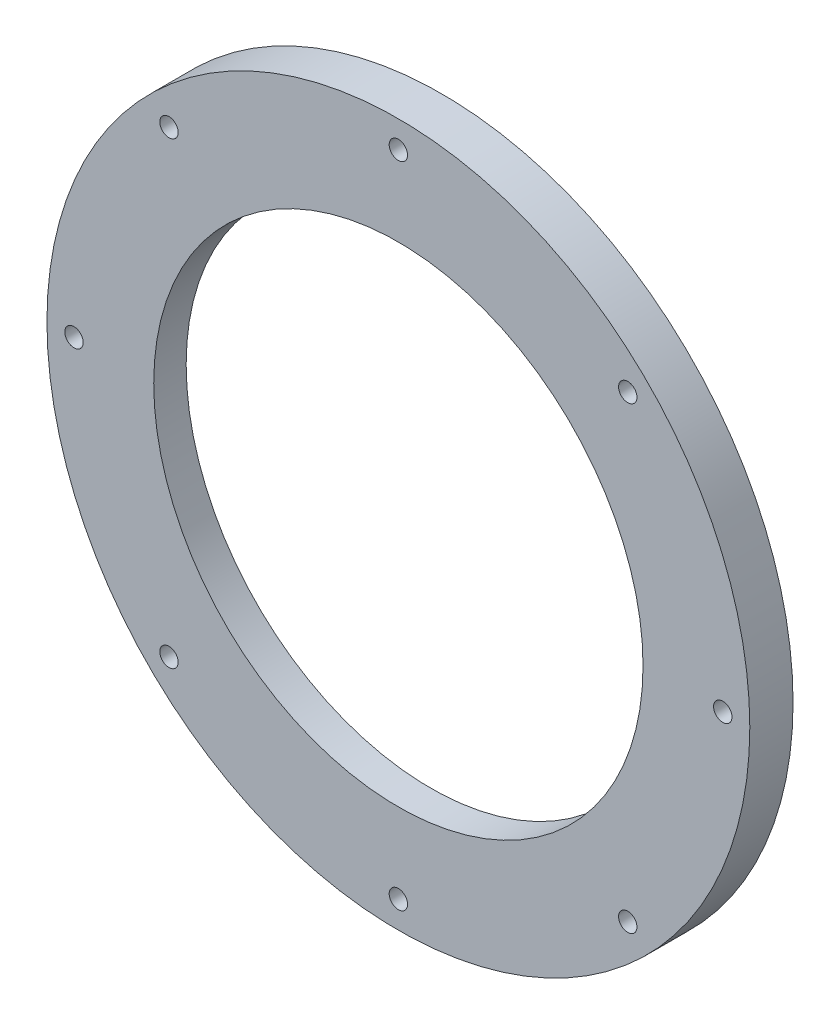
ISO-10303-21;
HEADER;
FILE_DESCRIPTION(('STEP AP214'),'2;1');
FILE_NAME('part.step','',(''),(''),'','','');
FILE_SCHEMA(('AUTOMOTIVE_DESIGN { 1 0 10303 214 1 1 1 1 }'));
ENDSEC;
DATA;
#1=APPLICATION_CONTEXT('core data for automotive mechanical design processes');
#2=APPLICATION_PROTOCOL_DEFINITION('international standard','automotive_design',2000,#1);
#3=PRODUCT_CONTEXT('',#1,'mechanical');
#4=PRODUCT('Part','Part','',(#3));
#5=PRODUCT_RELATED_PRODUCT_CATEGORY('part','',(#4));
#6=PRODUCT_DEFINITION_FORMATION('','',#4);
#7=PRODUCT_DEFINITION_CONTEXT('part definition',#1,'design');
#8=PRODUCT_DEFINITION('design','',#6,#7);
#9=PRODUCT_DEFINITION_SHAPE('','',#8);
#10=(LENGTH_UNIT() NAMED_UNIT(*) SI_UNIT(.MILLI.,.METRE.));
#11=(NAMED_UNIT(*) PLANE_ANGLE_UNIT() SI_UNIT($,.RADIAN.));
#12=(NAMED_UNIT(*) SI_UNIT($,.STERADIAN.) SOLID_ANGLE_UNIT());
#13=UNCERTAINTY_MEASURE_WITH_UNIT(LENGTH_MEASURE(1.E-05),#10,'distance_accuracy_value','');
#14=(GEOMETRIC_REPRESENTATION_CONTEXT(3) GLOBAL_UNCERTAINTY_ASSIGNED_CONTEXT((#13)) GLOBAL_UNIT_ASSIGNED_CONTEXT((#10,
#11,#12)) REPRESENTATION_CONTEXT('',''));
#15=CARTESIAN_POINT('',(0.,0.,0.));
#16=DIRECTION('',(0.,0.,1.));
#17=DIRECTION('',(1.,0.,0.));
#18=AXIS2_PLACEMENT_3D('',#15,#16,#17);
#19=CARTESIAN_POINT('',(0.,0.,4.));
#20=DIRECTION('',(0.,0.,-1.));
#21=DIRECTION('',(-1.,0.,0.));
#22=AXIS2_PLACEMENT_3D('',#19,#20,#21);
#23=CYLINDRICAL_SURFACE('',#22,45.25);
#24=CARTESIAN_POINT('',(0.,0.,4.));
#25=DIRECTION('',(0.,0.,1.));
#26=DIRECTION('',(1.,0.,0.));
#27=AXIS2_PLACEMENT_3D('',#24,#25,#26);
#28=CIRCLE('',#27,45.25);
#29=CARTESIAN_POINT('',(45.25,0.,4.));
#30=VERTEX_POINT('',#29);
#31=EDGE_CURVE('E44',#30,#30,#28,.T.);
#32=ORIENTED_EDGE('',*,*,#31,.T.);
#33=EDGE_LOOP('',(#32));
#34=FACE_BOUND('',#33,.T.);
#35=CARTESIAN_POINT('',(0.,0.,-2.));
#36=DIRECTION('',(0.,0.,-1.));
#37=DIRECTION('',(-1.,0.,0.));
#38=AXIS2_PLACEMENT_3D('',#35,#36,#37);
#39=CIRCLE('',#38,45.25);
#40=CARTESIAN_POINT('',(-45.25,0.,-2.));
#41=VERTEX_POINT('',#40);
#42=EDGE_CURVE('E35',#41,#41,#39,.T.);
#43=ORIENTED_EDGE('',*,*,#42,.T.);
#44=EDGE_LOOP('',(#43));
#45=FACE_BOUND('',#44,.T.);
#46=ADVANCED_FACE('F31',(#34,#45),#23,.F.);
#47=CARTESIAN_POINT('',(0.,0.,4.));
#48=DIRECTION('',(0.,0.,1.));
#49=DIRECTION('',(1.,0.,0.));
#50=AXIS2_PLACEMENT_3D('',#47,#48,#49);
#51=PLANE('',#50);
#52=CARTESIAN_POINT('',(0.,60.,4.));
#53=DIRECTION('',(0.,0.,1.));
#54=DIRECTION('',(1.,0.,0.));
#55=AXIS2_PLACEMENT_3D('',#52,#53,#54);
#56=CIRCLE('',#55,1.7);
#57=CARTESIAN_POINT('',(1.7,60.,4.));
#58=VERTEX_POINT('',#57);
#59=EDGE_CURVE('E93',#58,#58,#56,.T.);
#60=ORIENTED_EDGE('',*,*,#59,.F.);
#61=EDGE_LOOP('',(#60));
#62=FACE_BOUND('',#61,.T.);
#63=CARTESIAN_POINT('',(42.4264068711936,42.4264068711947,4.));
#64=DIRECTION('',(0.,0.,1.));
#65=DIRECTION('',(1.,0.,0.));
#66=AXIS2_PLACEMENT_3D('',#63,#64,#65);
#67=CIRCLE('',#66,1.7);
#68=CARTESIAN_POINT('',(44.1264068711936,42.4264068711947,4.));
#69=VERTEX_POINT('',#68);
#70=EDGE_CURVE('E87',#69,#69,#67,.T.);
#71=ORIENTED_EDGE('',*,*,#70,.F.);
#72=EDGE_LOOP('',(#71));
#73=FACE_BOUND('',#72,.T.);
#74=CARTESIAN_POINT('',(60.0000000000025,2.54693202754403E-12,4.));
#75=DIRECTION('',(0.,0.,1.));
#76=DIRECTION('',(1.,0.,0.));
#77=AXIS2_PLACEMENT_3D('',#74,#75,#76);
#78=CIRCLE('',#77,1.7);
#79=CARTESIAN_POINT('',(61.7000000000025,2.54693202754403E-12,4.));
#80=VERTEX_POINT('',#79);
#81=EDGE_CURVE('E81',#80,#80,#78,.T.);
#82=ORIENTED_EDGE('',*,*,#81,.F.);
#83=EDGE_LOOP('',(#82));
#84=FACE_BOUND('',#83,.T.);
#85=CARTESIAN_POINT('',(42.4264068711972,-42.426406871191,4.));
#86=DIRECTION('',(0.,0.,1.));
#87=DIRECTION('',(1.,0.,0.));
#88=AXIS2_PLACEMENT_3D('',#85,#86,#87);
#89=CIRCLE('',#88,1.7);
#90=CARTESIAN_POINT('',(44.1264068711972,-42.426406871191,4.));
#91=VERTEX_POINT('',#90);
#92=EDGE_CURVE('E75',#91,#91,#89,.T.);
#93=ORIENTED_EDGE('',*,*,#92,.F.);
#94=EDGE_LOOP('',(#93));
#95=FACE_BOUND('',#94,.T.);
#96=CARTESIAN_POINT('',(5.09386405508807E-12,-60.,4.));
#97=DIRECTION('',(0.,0.,1.));
#98=DIRECTION('',(1.,0.,0.));
#99=AXIS2_PLACEMENT_3D('',#96,#97,#98);
#100=CIRCLE('',#99,1.7);
#101=CARTESIAN_POINT('',(1.70000000000509,-60.,4.));
#102=VERTEX_POINT('',#101);
#103=EDGE_CURVE('E69',#102,#102,#100,.T.);
#104=ORIENTED_EDGE('',*,*,#103,.F.);
#105=EDGE_LOOP('',(#104));
#106=FACE_BOUND('',#105,.T.);
#107=CARTESIAN_POINT('',(-42.4264068711885,-42.4264068711947,4.));
#108=DIRECTION('',(0.,0.,1.));
#109=DIRECTION('',(1.,0.,0.));
#110=AXIS2_PLACEMENT_3D('',#107,#108,#109);
#111=CIRCLE('',#110,1.7);
#112=CARTESIAN_POINT('',(-40.7264068711885,-42.4264068711947,4.));
#113=VERTEX_POINT('',#112);
#114=EDGE_CURVE('E63',#113,#113,#111,.T.);
#115=ORIENTED_EDGE('',*,*,#114,.F.);
#116=EDGE_LOOP('',(#115));
#117=FACE_BOUND('',#116,.T.);
#118=CARTESIAN_POINT('',(-59.9999999999975,-2.55427990833892E-12,4.));
#119=DIRECTION('',(0.,0.,1.));
#120=DIRECTION('',(1.,0.,0.));
#121=AXIS2_PLACEMENT_3D('',#118,#119,#120);
#122=CIRCLE('',#121,1.7);
#123=CARTESIAN_POINT('',(-58.2999999999975,-2.55427990833892E-12,4.));
#124=VERTEX_POINT('',#123);
#125=EDGE_CURVE('E57',#124,#124,#122,.T.);
#126=ORIENTED_EDGE('',*,*,#125,.F.);
#127=EDGE_LOOP('',(#126));
#128=FACE_BOUND('',#127,.T.);
#129=CARTESIAN_POINT('',(-42.4264068711921,42.426406871191,4.));
#130=DIRECTION('',(0.,0.,1.));
#131=DIRECTION('',(1.,0.,0.));
#132=AXIS2_PLACEMENT_3D('',#129,#130,#131);
#133=CIRCLE('',#132,1.7);
#134=CARTESIAN_POINT('',(-40.7264068711921,42.426406871191,4.));
#135=VERTEX_POINT('',#134);
#136=EDGE_CURVE('E51',#135,#135,#133,.T.);
#137=ORIENTED_EDGE('',*,*,#136,.F.);
#138=EDGE_LOOP('',(#137));
#139=FACE_BOUND('',#138,.T.);
#140=CARTESIAN_POINT('',(0.,0.,4.));
#141=DIRECTION('',(0.,0.,1.));
#142=DIRECTION('',(1.,0.,0.));
#143=AXIS2_PLACEMENT_3D('',#140,#141,#142);
#144=CIRCLE('',#143,65.);
#145=CARTESIAN_POINT('',(65.,0.,4.));
#146=VERTEX_POINT('',#145);
#147=EDGE_CURVE('E10',#146,#146,#144,.T.);
#148=ORIENTED_EDGE('',*,*,#147,.T.);
#149=EDGE_LOOP('',(#148));
#150=FACE_BOUND('',#149,.T.);
#151=ORIENTED_EDGE('',*,*,#31,.F.);
#152=EDGE_LOOP('',(#151));
#153=FACE_BOUND('',#152,.T.);
#154=ADVANCED_FACE('F118',(#62,#73,#84,#95,#106,#117,#128,#139,#150,#153),#51,.T.);
#155=CARTESIAN_POINT('',(0.,0.,-4.));
#156=DIRECTION('',(0.,0.,1.));
#157=DIRECTION('',(1.,0.,0.));
#158=AXIS2_PLACEMENT_3D('',#155,#156,#157);
#159=PLANE('',#158);
#160=CARTESIAN_POINT('',(0.,0.,-4.));
#161=DIRECTION('',(0.,0.,-1.));
#162=DIRECTION('',(-1.,0.,0.));
#163=AXIS2_PLACEMENT_3D('',#160,#161,#162);
#164=CIRCLE('',#163,50.);
#165=CARTESIAN_POINT('',(-50.,0.,-4.));
#166=VERTEX_POINT('',#165);
#167=EDGE_CURVE('E96',#166,#166,#164,.T.);
#168=ORIENTED_EDGE('',*,*,#167,.F.);
#169=EDGE_LOOP('',(#168));
#170=FACE_BOUND('',#169,.T.);
#171=CARTESIAN_POINT('',(0.,60.,-4.));
#172=DIRECTION('',(0.,0.,1.));
#173=DIRECTION('',(1.,0.,0.));
#174=AXIS2_PLACEMENT_3D('',#171,#172,#173);
#175=CIRCLE('',#174,1.7);
#176=CARTESIAN_POINT('',(1.7,60.,-4.));
#177=VERTEX_POINT('',#176);
#178=EDGE_CURVE('E90',#177,#177,#175,.T.);
#179=ORIENTED_EDGE('',*,*,#178,.T.);
#180=EDGE_LOOP('',(#179));
#181=FACE_BOUND('',#180,.T.);
#182=CARTESIAN_POINT('',(42.4264068711936,42.4264068711947,-4.));
#183=DIRECTION('',(0.,0.,1.));
#184=DIRECTION('',(1.,0.,0.));
#185=AXIS2_PLACEMENT_3D('',#182,#183,#184);
#186=CIRCLE('',#185,1.7);
#187=CARTESIAN_POINT('',(44.1264068711936,42.4264068711947,-4.));
#188=VERTEX_POINT('',#187);
#189=EDGE_CURVE('E84',#188,#188,#186,.T.);
#190=ORIENTED_EDGE('',*,*,#189,.T.);
#191=EDGE_LOOP('',(#190));
#192=FACE_BOUND('',#191,.T.);
#193=CARTESIAN_POINT('',(60.0000000000025,2.54693202754403E-12,-4.));
#194=DIRECTION('',(0.,0.,1.));
#195=DIRECTION('',(1.,0.,0.));
#196=AXIS2_PLACEMENT_3D('',#193,#194,#195);
#197=CIRCLE('',#196,1.7);
#198=CARTESIAN_POINT('',(61.7000000000025,2.54693202754403E-12,-4.));
#199=VERTEX_POINT('',#198);
#200=EDGE_CURVE('E78',#199,#199,#197,.T.);
#201=ORIENTED_EDGE('',*,*,#200,.T.);
#202=EDGE_LOOP('',(#201));
#203=FACE_BOUND('',#202,.T.);
#204=CARTESIAN_POINT('',(42.4264068711972,-42.426406871191,-4.));
#205=DIRECTION('',(0.,0.,1.));
#206=DIRECTION('',(1.,0.,0.));
#207=AXIS2_PLACEMENT_3D('',#204,#205,#206);
#208=CIRCLE('',#207,1.7);
#209=CARTESIAN_POINT('',(44.1264068711972,-42.426406871191,-4.));
#210=VERTEX_POINT('',#209);
#211=EDGE_CURVE('E72',#210,#210,#208,.T.);
#212=ORIENTED_EDGE('',*,*,#211,.T.);
#213=EDGE_LOOP('',(#212));
#214=FACE_BOUND('',#213,.T.);
#215=CARTESIAN_POINT('',(5.09386405508807E-12,-60.,-4.));
#216=DIRECTION('',(0.,0.,1.));
#217=DIRECTION('',(1.,0.,0.));
#218=AXIS2_PLACEMENT_3D('',#215,#216,#217);
#219=CIRCLE('',#218,1.7);
#220=CARTESIAN_POINT('',(1.70000000000509,-60.,-4.));
#221=VERTEX_POINT('',#220);
#222=EDGE_CURVE('E66',#221,#221,#219,.T.);
#223=ORIENTED_EDGE('',*,*,#222,.T.);
#224=EDGE_LOOP('',(#223));
#225=FACE_BOUND('',#224,.T.);
#226=CARTESIAN_POINT('',(-42.4264068711885,-42.4264068711947,-4.));
#227=DIRECTION('',(0.,0.,1.));
#228=DIRECTION('',(1.,0.,0.));
#229=AXIS2_PLACEMENT_3D('',#226,#227,#228);
#230=CIRCLE('',#229,1.7);
#231=CARTESIAN_POINT('',(-40.7264068711885,-42.4264068711947,-4.));
#232=VERTEX_POINT('',#231);
#233=EDGE_CURVE('E60',#232,#232,#230,.T.);
#234=ORIENTED_EDGE('',*,*,#233,.T.);
#235=EDGE_LOOP('',(#234));
#236=FACE_BOUND('',#235,.T.);
#237=CARTESIAN_POINT('',(-59.9999999999975,-2.55427990833892E-12,-4.));
#238=DIRECTION('',(0.,0.,1.));
#239=DIRECTION('',(1.,0.,0.));
#240=AXIS2_PLACEMENT_3D('',#237,#238,#239);
#241=CIRCLE('',#240,1.7);
#242=CARTESIAN_POINT('',(-58.2999999999975,-2.55427990833892E-12,-4.));
#243=VERTEX_POINT('',#242);
#244=EDGE_CURVE('E54',#243,#243,#241,.T.);
#245=ORIENTED_EDGE('',*,*,#244,.T.);
#246=EDGE_LOOP('',(#245));
#247=FACE_BOUND('',#246,.T.);
#248=CARTESIAN_POINT('',(-42.4264068711921,42.426406871191,-4.));
#249=DIRECTION('',(0.,0.,1.));
#250=DIRECTION('',(1.,0.,0.));
#251=AXIS2_PLACEMENT_3D('',#248,#249,#250);
#252=CIRCLE('',#251,1.7);
#253=CARTESIAN_POINT('',(-40.7264068711921,42.426406871191,-4.));
#254=VERTEX_POINT('',#253);
#255=EDGE_CURVE('E48',#254,#254,#252,.T.);
#256=ORIENTED_EDGE('',*,*,#255,.T.);
#257=EDGE_LOOP('',(#256));
#258=FACE_BOUND('',#257,.T.);
#259=CARTESIAN_POINT('',(0.,0.,-4.));
#260=DIRECTION('',(0.,0.,1.));
#261=DIRECTION('',(1.,0.,0.));
#262=AXIS2_PLACEMENT_3D('',#259,#260,#261);
#263=CIRCLE('',#262,65.);
#264=CARTESIAN_POINT('',(65.,0.,-4.));
#265=VERTEX_POINT('',#264);
#266=EDGE_CURVE('E39',#265,#265,#263,.T.);
#267=ORIENTED_EDGE('',*,*,#266,.F.);
#268=EDGE_LOOP('',(#267));
#269=FACE_BOUND('',#268,.T.);
#270=ADVANCED_FACE('F124',(#170,#181,#192,#203,#214,#225,#236,#247,#258,#269),#159,.F.);
#271=CARTESIAN_POINT('',(0.,0.,4.));
#272=DIRECTION('',(0.,0.,-1.));
#273=DIRECTION('',(-1.,0.,0.));
#274=AXIS2_PLACEMENT_3D('',#271,#272,#273);
#275=CYLINDRICAL_SURFACE('',#274,65.);
#276=ORIENTED_EDGE('',*,*,#147,.F.);
#277=EDGE_LOOP('',(#276));
#278=FACE_BOUND('',#277,.T.);
#279=ORIENTED_EDGE('',*,*,#266,.T.);
#280=EDGE_LOOP('',(#279));
#281=FACE_BOUND('',#280,.T.);
#282=ADVANCED_FACE('F33',(#278,#281),#275,.T.);
#283=CARTESIAN_POINT('',(-42.4264068711921,42.426406871191,4.));
#284=DIRECTION('',(0.,0.,1.));
#285=DIRECTION('',(1.,0.,0.));
#286=AXIS2_PLACEMENT_3D('',#283,#284,#285);
#287=CYLINDRICAL_SURFACE('',#286,1.7);
#288=ORIENTED_EDGE('',*,*,#255,.F.);
#289=EDGE_LOOP('',(#288));
#290=FACE_BOUND('',#289,.T.);
#291=ORIENTED_EDGE('',*,*,#136,.T.);
#292=EDGE_LOOP('',(#291));
#293=FACE_BOUND('',#292,.T.);
#294=ADVANCED_FACE('F128',(#290,#293),#287,.F.);
#295=CARTESIAN_POINT('',(-59.9999999999975,-2.55427990833892E-12,4.));
#296=DIRECTION('',(0.,0.,1.));
#297=DIRECTION('',(1.,0.,0.));
#298=AXIS2_PLACEMENT_3D('',#295,#296,#297);
#299=CYLINDRICAL_SURFACE('',#298,1.7);
#300=ORIENTED_EDGE('',*,*,#244,.F.);
#301=EDGE_LOOP('',(#300));
#302=FACE_BOUND('',#301,.T.);
#303=ORIENTED_EDGE('',*,*,#125,.T.);
#304=EDGE_LOOP('',(#303));
#305=FACE_BOUND('',#304,.T.);
#306=ADVANCED_FACE('F159',(#302,#305),#299,.F.);
#307=CARTESIAN_POINT('',(-42.4264068711885,-42.4264068711947,4.));
#308=DIRECTION('',(0.,0.,1.));
#309=DIRECTION('',(1.,0.,0.));
#310=AXIS2_PLACEMENT_3D('',#307,#308,#309);
#311=CYLINDRICAL_SURFACE('',#310,1.7);
#312=ORIENTED_EDGE('',*,*,#233,.F.);
#313=EDGE_LOOP('',(#312));
#314=FACE_BOUND('',#313,.T.);
#315=ORIENTED_EDGE('',*,*,#114,.T.);
#316=EDGE_LOOP('',(#315));
#317=FACE_BOUND('',#316,.T.);
#318=ADVANCED_FACE('F167',(#314,#317),#311,.F.);
#319=CARTESIAN_POINT('',(5.09386405508807E-12,-60.,4.));
#320=DIRECTION('',(0.,0.,1.));
#321=DIRECTION('',(1.,0.,0.));
#322=AXIS2_PLACEMENT_3D('',#319,#320,#321);
#323=CYLINDRICAL_SURFACE('',#322,1.7);
#324=ORIENTED_EDGE('',*,*,#222,.F.);
#325=EDGE_LOOP('',(#324));
#326=FACE_BOUND('',#325,.T.);
#327=ORIENTED_EDGE('',*,*,#103,.T.);
#328=EDGE_LOOP('',(#327));
#329=FACE_BOUND('',#328,.T.);
#330=ADVANCED_FACE('F172',(#326,#329),#323,.F.);
#331=CARTESIAN_POINT('',(42.4264068711972,-42.426406871191,4.));
#332=DIRECTION('',(0.,0.,1.));
#333=DIRECTION('',(1.,0.,0.));
#334=AXIS2_PLACEMENT_3D('',#331,#332,#333);
#335=CYLINDRICAL_SURFACE('',#334,1.7);
#336=ORIENTED_EDGE('',*,*,#211,.F.);
#337=EDGE_LOOP('',(#336));
#338=FACE_BOUND('',#337,.T.);
#339=ORIENTED_EDGE('',*,*,#92,.T.);
#340=EDGE_LOOP('',(#339));
#341=FACE_BOUND('',#340,.T.);
#342=ADVANCED_FACE('F179',(#338,#341),#335,.F.);
#343=CARTESIAN_POINT('',(60.0000000000025,2.54693202754403E-12,4.));
#344=DIRECTION('',(0.,0.,1.));
#345=DIRECTION('',(1.,0.,0.));
#346=AXIS2_PLACEMENT_3D('',#343,#344,#345);
#347=CYLINDRICAL_SURFACE('',#346,1.7);
#348=ORIENTED_EDGE('',*,*,#200,.F.);
#349=EDGE_LOOP('',(#348));
#350=FACE_BOUND('',#349,.T.);
#351=ORIENTED_EDGE('',*,*,#81,.T.);
#352=EDGE_LOOP('',(#351));
#353=FACE_BOUND('',#352,.T.);
#354=ADVANCED_FACE('F183',(#350,#353),#347,.F.);
#355=CARTESIAN_POINT('',(42.4264068711936,42.4264068711947,4.));
#356=DIRECTION('',(0.,0.,1.));
#357=DIRECTION('',(1.,0.,0.));
#358=AXIS2_PLACEMENT_3D('',#355,#356,#357);
#359=CYLINDRICAL_SURFACE('',#358,1.7);
#360=ORIENTED_EDGE('',*,*,#189,.F.);
#361=EDGE_LOOP('',(#360));
#362=FACE_BOUND('',#361,.T.);
#363=ORIENTED_EDGE('',*,*,#70,.T.);
#364=EDGE_LOOP('',(#363));
#365=FACE_BOUND('',#364,.T.);
#366=ADVANCED_FACE('F187',(#362,#365),#359,.F.);
#367=CARTESIAN_POINT('',(0.,60.,4.));
#368=DIRECTION('',(0.,0.,1.));
#369=DIRECTION('',(1.,0.,0.));
#370=AXIS2_PLACEMENT_3D('',#367,#368,#369);
#371=CYLINDRICAL_SURFACE('',#370,1.7);
#372=ORIENTED_EDGE('',*,*,#178,.F.);
#373=EDGE_LOOP('',(#372));
#374=FACE_BOUND('',#373,.T.);
#375=ORIENTED_EDGE('',*,*,#59,.T.);
#376=EDGE_LOOP('',(#375));
#377=FACE_BOUND('',#376,.T.);
#378=ADVANCED_FACE('F114',(#374,#377),#371,.F.);
#379=CARTESIAN_POINT('',(0.,0.,-2.));
#380=DIRECTION('',(0.,0.,-1.));
#381=DIRECTION('',(-1.,0.,0.));
#382=AXIS2_PLACEMENT_3D('',#379,#380,#381);
#383=CYLINDRICAL_SURFACE('',#382,50.);
#384=CARTESIAN_POINT('',(0.,0.,-2.));
#385=DIRECTION('',(0.,0.,-1.));
#386=DIRECTION('',(-1.,0.,0.));
#387=AXIS2_PLACEMENT_3D('',#384,#385,#386);
#388=CIRCLE('',#387,50.);
#389=CARTESIAN_POINT('',(-50.,0.,-2.));
#390=VERTEX_POINT('',#389);
#391=EDGE_CURVE('E99',#390,#390,#388,.T.);
#392=ORIENTED_EDGE('',*,*,#391,.F.);
#393=EDGE_LOOP('',(#392));
#394=FACE_BOUND('',#393,.T.);
#395=ORIENTED_EDGE('',*,*,#167,.T.);
#396=EDGE_LOOP('',(#395));
#397=FACE_BOUND('',#396,.T.);
#398=ADVANCED_FACE('F109',(#394,#397),#383,.F.);
#399=CARTESIAN_POINT('',(0.,0.,-2.));
#400=DIRECTION('',(0.,0.,-1.));
#401=DIRECTION('',(-1.,0.,0.));
#402=AXIS2_PLACEMENT_3D('',#399,#400,#401);
#403=PLANE('',#402);
#404=ORIENTED_EDGE('',*,*,#42,.F.);
#405=EDGE_LOOP('',(#404));
#406=FACE_BOUND('',#405,.T.);
#407=ORIENTED_EDGE('',*,*,#391,.T.);
#408=EDGE_LOOP('',(#407));
#409=FACE_BOUND('',#408,.T.);
#410=ADVANCED_FACE('F107',(#406,#409),#403,.T.);
#411=CLOSED_SHELL('',(#46,#154,#270,#282,#294,#306,#318,#330,#342,#354,#366,#378,#398,#410));
#412=MANIFOLD_SOLID_BREP('B2',#411);
#413=ADVANCED_BREP_SHAPE_REPRESENTATION('',(#18,#412),#14);
#414=SHAPE_DEFINITION_REPRESENTATION(#9,#413);
ENDSEC;
END-ISO-10303-21;
